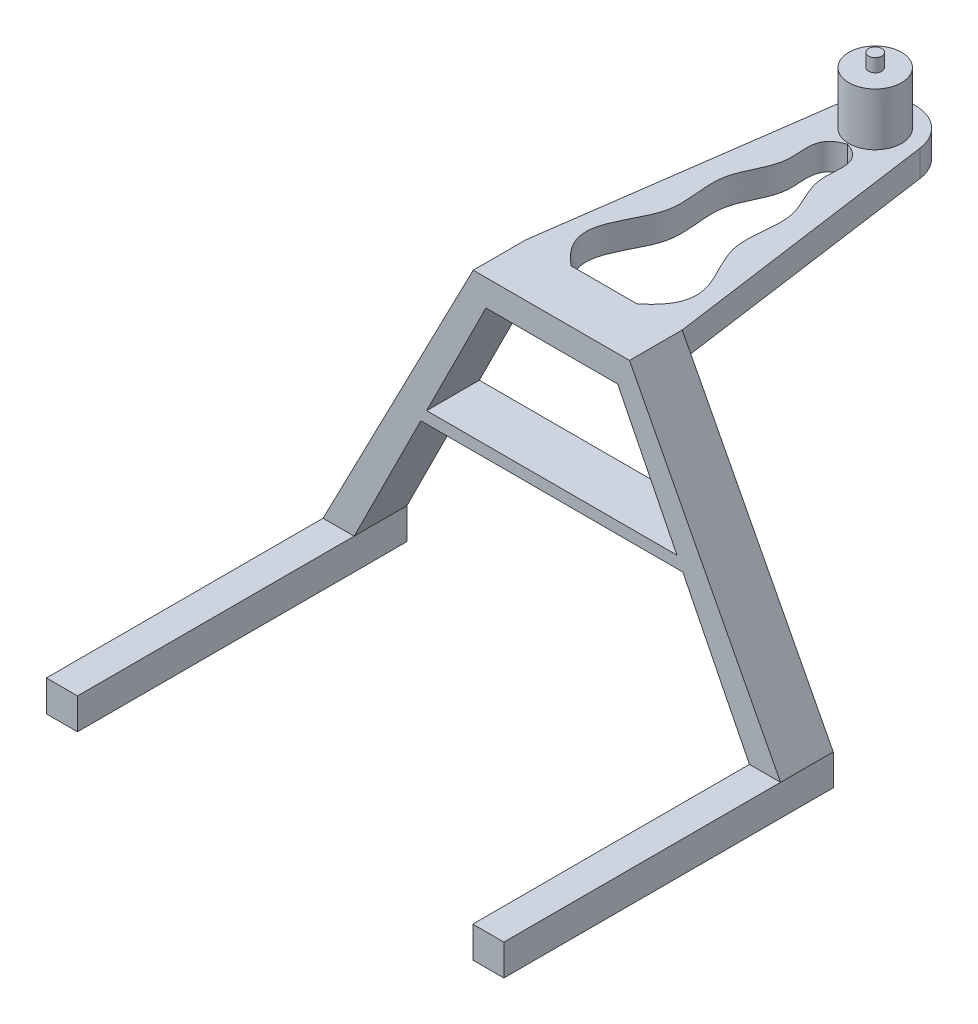
ISO-10303-21;
HEADER;
FILE_DESCRIPTION(('STEP AP214'),'2;1');
FILE_NAME('part.step','',(''),(''),'','','');
FILE_SCHEMA(('AUTOMOTIVE_DESIGN { 1 0 10303 214 1 1 1 1 }'));
ENDSEC;
DATA;
#1=APPLICATION_CONTEXT('core data for automotive mechanical design processes');
#2=APPLICATION_PROTOCOL_DEFINITION('international standard','automotive_design',2000,#1);
#3=PRODUCT_CONTEXT('',#1,'mechanical');
#4=PRODUCT('Part','Part','',(#3));
#5=PRODUCT_RELATED_PRODUCT_CATEGORY('part','',(#4));
#6=PRODUCT_DEFINITION_FORMATION('','',#4);
#7=PRODUCT_DEFINITION_CONTEXT('part definition',#1,'design');
#8=PRODUCT_DEFINITION('design','',#6,#7);
#9=PRODUCT_DEFINITION_SHAPE('','',#8);
#10=(LENGTH_UNIT() NAMED_UNIT(*) SI_UNIT(.MILLI.,.METRE.));
#11=(NAMED_UNIT(*) PLANE_ANGLE_UNIT() SI_UNIT($,.RADIAN.));
#12=(NAMED_UNIT(*) SI_UNIT($,.STERADIAN.) SOLID_ANGLE_UNIT());
#13=UNCERTAINTY_MEASURE_WITH_UNIT(LENGTH_MEASURE(1.E-05),#10,'distance_accuracy_value','');
#14=(GEOMETRIC_REPRESENTATION_CONTEXT(3) GLOBAL_UNCERTAINTY_ASSIGNED_CONTEXT((#13)) GLOBAL_UNIT_ASSIGNED_CONTEXT((#10,
#11,#12)) REPRESENTATION_CONTEXT('',''));
#15=CARTESIAN_POINT('',(0.,0.,0.));
#16=DIRECTION('',(0.,0.,1.));
#17=DIRECTION('',(1.,0.,0.));
#18=AXIS2_PLACEMENT_3D('',#15,#16,#17);
#19=CARTESIAN_POINT('',(0.,0.,0.));
#20=DIRECTION('',(0.,0.,1.));
#21=DIRECTION('',(1.,0.,0.));
#22=AXIS2_PLACEMENT_3D('',#19,#20,#21);
#23=PLANE('',#22);
#24=DIRECTION('',(0.447213595499958,-0.894427190999916,0.));
#25=VECTOR('',#24,1.);
#26=CARTESIAN_POINT('',(508.,567.9694,0.));
#27=LINE('',#26,#25);
#28=CARTESIAN_POINT('',(633.562258810129,316.844882379742,0.));
#29=VERTEX_POINT('',#28);
#30=CARTESIAN_POINT('',(762.,59.9694000000002,0.));
#31=VERTEX_POINT('',#30);
#32=EDGE_CURVE('E395',#29,#31,#27,.T.);
#33=ORIENTED_EDGE('',*,*,#32,.F.);
#34=DIRECTION('',(1.,0.,0.));
#35=VECTOR('',#34,1.);
#36=CARTESIAN_POINT('',(688.093813572336,316.844882379742,0.));
#37=LINE('',#36,#35);
#38=CARTESIAN_POINT('',(128.437741189871,316.844882379742,0.));
#39=VERTEX_POINT('',#38);
#40=EDGE_CURVE('E284',#39,#29,#37,.T.);
#41=ORIENTED_EDGE('',*,*,#40,.F.);
#42=DIRECTION('',(0.447213595499958,0.894427190999916,0.));
#43=VECTOR('',#42,1.);
#44=CARTESIAN_POINT('',(0.,59.9694,0.));
#45=LINE('',#44,#43);
#46=CARTESIAN_POINT('',(0.,59.9694,0.));
#47=VERTEX_POINT('',#46);
#48=EDGE_CURVE('E392',#47,#39,#45,.T.);
#49=ORIENTED_EDGE('',*,*,#48,.F.);
#50=DIRECTION('',(0.,1.,0.));
#51=VECTOR('',#50,1.);
#52=CARTESIAN_POINT('',(0.,0.,0.));
#53=LINE('',#52,#51);
#54=CARTESIAN_POINT('',(0.,0.,0.));
#55=VERTEX_POINT('',#54);
#56=EDGE_CURVE('E437',#55,#47,#53,.T.);
#57=ORIENTED_EDGE('',*,*,#56,.F.);
#58=DIRECTION('',(1.,0.,0.));
#59=VECTOR('',#58,1.);
#60=CARTESIAN_POINT('',(0.,0.,0.));
#61=LINE('',#60,#59);
#62=CARTESIAN_POINT('',(-59.9694,0.,0.));
#63=VERTEX_POINT('',#62);
#64=EDGE_CURVE('E443',#63,#55,#61,.T.);
#65=ORIENTED_EDGE('',*,*,#64,.F.);
#66=DIRECTION('',(0.,-1.,0.));
#67=VECTOR('',#66,1.);
#68=CARTESIAN_POINT('',(-59.9694,0.,0.));
#69=LINE('',#68,#67);
#70=CARTESIAN_POINT('',(-59.9694,59.9694,0.));
#71=VERTEX_POINT('',#70);
#72=EDGE_CURVE('E455',#71,#63,#69,.T.);
#73=ORIENTED_EDGE('',*,*,#72,.F.);
#74=DIRECTION('',(-0.45998927295107,-0.88792447244681,0.));
#75=VECTOR('',#74,1.);
#76=CARTESIAN_POINT('',(-59.9694,59.9694,0.));
#77=LINE('',#76,#75);
#78=CARTESIAN_POINT('',(229.51694,618.7694,0.));
#79=VERTEX_POINT('',#78);
#80=EDGE_CURVE('E403',#79,#71,#77,.T.);
#81=ORIENTED_EDGE('',*,*,#80,.F.);
#82=DIRECTION('',(0.,1.,0.));
#83=VECTOR('',#82,1.);
#84=CARTESIAN_POINT('',(229.51694,567.9694,0.));
#85=LINE('',#84,#83);
#86=CARTESIAN_POINT('',(229.51694,567.9694,0.));
#87=VERTEX_POINT('',#86);
#88=EDGE_CURVE('E281',#87,#79,#85,.T.);
#89=ORIENTED_EDGE('',*,*,#88,.F.);
#90=DIRECTION('',(1.,0.,0.));
#91=VECTOR('',#90,1.);
#92=CARTESIAN_POINT('',(229.51694,567.9694,0.));
#93=LINE('',#92,#91);
#94=CARTESIAN_POINT('',(254.,567.9694,0.));
#95=VERTEX_POINT('',#94);
#96=EDGE_CURVE('E250',#87,#95,#93,.T.);
#97=ORIENTED_EDGE('',*,*,#96,.T.);
#98=CARTESIAN_POINT('',(139.7,339.3694,0.));
#99=VERTEX_POINT('',#98);
#100=EDGE_CURVE('E360',#99,#95,#45,.T.);
#101=ORIENTED_EDGE('',*,*,#100,.F.);
#102=DIRECTION('',(-1.,0.,0.));
#103=VECTOR('',#102,1.);
#104=CARTESIAN_POINT('',(84.7737699999999,339.3694,0.));
#105=LINE('',#104,#103);
#106=CARTESIAN_POINT('',(622.3,339.3694,0.));
#107=VERTEX_POINT('',#106);
#108=EDGE_CURVE('E299',#107,#99,#105,.T.);
#109=ORIENTED_EDGE('',*,*,#108,.F.);
#110=CARTESIAN_POINT('',(508.,567.9694,0.));
#111=VERTEX_POINT('',#110);
#112=EDGE_CURVE('E396',#111,#107,#27,.T.);
#113=ORIENTED_EDGE('',*,*,#112,.F.);
#114=CARTESIAN_POINT('',(530.740058052968,567.9694,0.));
#115=VERTEX_POINT('',#114);
#116=EDGE_CURVE('E258',#111,#115,#93,.T.);
#117=ORIENTED_EDGE('',*,*,#116,.T.);
#118=DIRECTION('',(0.,1.,0.));
#119=VECTOR('',#118,1.);
#120=CARTESIAN_POINT('',(530.740058052968,567.9694,0.));
#121=LINE('',#120,#119);
#122=CARTESIAN_POINT('',(530.740058052968,618.7694,0.));
#123=VERTEX_POINT('',#122);
#124=EDGE_CURVE('E270',#115,#123,#121,.T.);
#125=ORIENTED_EDGE('',*,*,#124,.T.);
#126=DIRECTION('',(-0.462168682907567,0.88679203229364,0.));
#127=VECTOR('',#126,1.);
#128=CARTESIAN_POINT('',(821.9694,59.9694000000002,0.));
#129=LINE('',#128,#127);
#130=CARTESIAN_POINT('',(821.9694,59.9694000000002,0.));
#131=VERTEX_POINT('',#130);
#132=EDGE_CURVE('E399',#131,#123,#129,.T.);
#133=ORIENTED_EDGE('',*,*,#132,.F.);
#134=DIRECTION('',(0.,1.,0.));
#135=VECTOR('',#134,1.);
#136=CARTESIAN_POINT('',(821.9694,1.94694268781174E-13,0.));
#137=LINE('',#136,#135);
#138=CARTESIAN_POINT('',(821.9694,1.94694268781174E-13,0.));
#139=VERTEX_POINT('',#138);
#140=EDGE_CURVE('E323',#139,#131,#137,.T.);
#141=ORIENTED_EDGE('',*,*,#140,.F.);
#142=DIRECTION('',(1.,0.,0.));
#143=VECTOR('',#142,1.);
#144=CARTESIAN_POINT('',(821.9694,1.94694268781174E-13,0.));
#145=LINE('',#144,#143);
#146=CARTESIAN_POINT('',(762.,1.87350135405495E-13,0.));
#147=VERTEX_POINT('',#146);
#148=EDGE_CURVE('E329',#147,#139,#145,.T.);
#149=ORIENTED_EDGE('',*,*,#148,.F.);
#150=DIRECTION('',(0.,-1.,0.));
#151=VECTOR('',#150,1.);
#152=CARTESIAN_POINT('',(762.,1.87350135405495E-13,0.));
#153=LINE('',#152,#151);
#154=EDGE_CURVE('E341',#31,#147,#153,.T.);
#155=ORIENTED_EDGE('',*,*,#154,.F.);
#156=EDGE_LOOP('',(#33,#41,#49,#57,#65,#73,#81,#89,#97,#101,#109,#113,#117,#125,#133,#141,#149,#155));
#157=FACE_BOUND('',#156,.T.);
#158=ADVANCED_FACE('F38',(#157),#23,.F.);
#159=CARTESIAN_POINT('',(0.,59.9694,101.6));
#160=DIRECTION('',(-0.894427190999916,0.447213595499958,0.));
#161=DIRECTION('',(-0.447213595499958,-0.894427190999916,0.));
#162=AXIS2_PLACEMENT_3D('',#159,#160,#161);
#163=PLANE('',#162);
#164=DIRECTION('',(0.,0.,-1.));
#165=VECTOR('',#164,1.);
#166=CARTESIAN_POINT('',(128.437741189871,316.844882379742,101.6));
#167=LINE('',#166,#165);
#168=CARTESIAN_POINT('',(128.437741189871,316.844882379742,101.6));
#169=VERTEX_POINT('',#168);
#170=EDGE_CURVE('E319',#169,#39,#167,.T.);
#171=ORIENTED_EDGE('',*,*,#170,.F.);
#172=DIRECTION('',(0.447213595499958,0.894427190999916,0.));
#173=VECTOR('',#172,1.);
#174=CARTESIAN_POINT('',(0.,59.9694,101.6));
#175=LINE('',#174,#173);
#176=CARTESIAN_POINT('',(0.,59.9694,101.6));
#177=VERTEX_POINT('',#176);
#178=EDGE_CURVE('E361',#177,#169,#175,.T.);
#179=ORIENTED_EDGE('',*,*,#178,.F.);
#180=DIRECTION('',(0.,0.,-1.));
#181=VECTOR('',#180,1.);
#182=CARTESIAN_POINT('',(0.,59.9694,101.6));
#183=LINE('',#182,#181);
#184=EDGE_CURVE('E391',#177,#47,#183,.T.);
#185=ORIENTED_EDGE('',*,*,#184,.T.);
#186=ORIENTED_EDGE('',*,*,#48,.T.);
#187=EDGE_LOOP('',(#171,#179,#185,#186));
#188=FACE_BOUND('',#187,.T.);
#189=ADVANCED_FACE('F501',(#188),#163,.F.);
#190=DIRECTION('',(0.,0.,1.));
#191=VECTOR('',#190,1.);
#192=CARTESIAN_POINT('',(139.7,339.3694,101.6));
#193=LINE('',#192,#191);
#194=CARTESIAN_POINT('',(139.7,339.3694,101.6));
#195=VERTEX_POINT('',#194);
#196=EDGE_CURVE('E311',#99,#195,#193,.T.);
#197=ORIENTED_EDGE('',*,*,#196,.F.);
#198=ORIENTED_EDGE('',*,*,#100,.T.);
#199=DIRECTION('',(0.,0.,-1.));
#200=VECTOR('',#199,1.);
#201=CARTESIAN_POINT('',(254.,567.9694,101.6));
#202=LINE('',#201,#200);
#203=CARTESIAN_POINT('',(254.,567.9694,101.6));
#204=VERTEX_POINT('',#203);
#205=EDGE_CURVE('E433',#204,#95,#202,.T.);
#206=ORIENTED_EDGE('',*,*,#205,.F.);
#207=EDGE_CURVE('E366',#195,#204,#175,.T.);
#208=ORIENTED_EDGE('',*,*,#207,.F.);
#209=EDGE_LOOP('',(#197,#198,#206,#208));
#210=FACE_BOUND('',#209,.T.);
#211=ADVANCED_FACE('F506',(#210),#163,.F.);
#212=CARTESIAN_POINT('',(508.,567.9694,101.6));
#213=DIRECTION('',(0.894427190999916,0.447213595499958,0.));
#214=DIRECTION('',(-0.447213595499958,0.894427190999916,0.));
#215=AXIS2_PLACEMENT_3D('',#212,#213,#214);
#216=PLANE('',#215);
#217=DIRECTION('',(0.,0.,1.));
#218=VECTOR('',#217,1.);
#219=CARTESIAN_POINT('',(633.562258810129,316.844882379742,101.6));
#220=LINE('',#219,#218);
#221=CARTESIAN_POINT('',(633.562258810129,316.844882379742,101.6));
#222=VERTEX_POINT('',#221);
#223=EDGE_CURVE('E315',#29,#222,#220,.T.);
#224=ORIENTED_EDGE('',*,*,#223,.F.);
#225=ORIENTED_EDGE('',*,*,#32,.T.);
#226=DIRECTION('',(0.,0.,-1.));
#227=VECTOR('',#226,1.);
#228=CARTESIAN_POINT('',(762.,59.9694000000002,101.6));
#229=LINE('',#228,#227);
#230=CARTESIAN_POINT('',(762.,59.9694000000002,101.6));
#231=VERTEX_POINT('',#230);
#232=EDGE_CURVE('E425',#231,#31,#229,.T.);
#233=ORIENTED_EDGE('',*,*,#232,.F.);
#234=DIRECTION('',(0.447213595499958,-0.894427190999916,0.));
#235=VECTOR('',#234,1.);
#236=CARTESIAN_POINT('',(508.,567.9694,101.6));
#237=LINE('',#236,#235);
#238=EDGE_CURVE('E369',#222,#231,#237,.T.);
#239=ORIENTED_EDGE('',*,*,#238,.F.);
#240=EDGE_LOOP('',(#224,#225,#233,#239));
#241=FACE_BOUND('',#240,.T.);
#242=ADVANCED_FACE('F528',(#241),#216,.F.);
#243=DIRECTION('',(0.,0.,-1.));
#244=VECTOR('',#243,1.);
#245=CARTESIAN_POINT('',(622.3,339.3694,101.6));
#246=LINE('',#245,#244);
#247=CARTESIAN_POINT('',(622.3,339.3694,101.6));
#248=VERTEX_POINT('',#247);
#249=EDGE_CURVE('E303',#248,#107,#246,.T.);
#250=ORIENTED_EDGE('',*,*,#249,.F.);
#251=CARTESIAN_POINT('',(508.,567.9694,101.6));
#252=VERTEX_POINT('',#251);
#253=EDGE_CURVE('E370',#252,#248,#237,.T.);
#254=ORIENTED_EDGE('',*,*,#253,.F.);
#255=DIRECTION('',(0.,0.,-1.));
#256=VECTOR('',#255,1.);
#257=CARTESIAN_POINT('',(508.,567.9694,101.6));
#258=LINE('',#257,#256);
#259=EDGE_CURVE('E429',#252,#111,#258,.T.);
#260=ORIENTED_EDGE('',*,*,#259,.T.);
#261=ORIENTED_EDGE('',*,*,#112,.T.);
#262=EDGE_LOOP('',(#250,#254,#260,#261));
#263=FACE_BOUND('',#262,.T.);
#264=ADVANCED_FACE('F522',(#263),#216,.F.);
#265=CARTESIAN_POINT('',(0.,59.9694,635.));
#266=DIRECTION('',(0.,-1.,0.));
#267=DIRECTION('',(0.,0.,-1.));
#268=AXIS2_PLACEMENT_3D('',#265,#266,#267);
#269=PLANE('',#268);
#270=DIRECTION('',(1.,0.,0.));
#271=VECTOR('',#270,1.);
#272=CARTESIAN_POINT('',(0.,59.9694,101.6));
#273=LINE('',#272,#271);
#274=CARTESIAN_POINT('',(-59.9694,59.9694,101.6));
#275=VERTEX_POINT('',#274);
#276=EDGE_CURVE('E387',#275,#177,#273,.T.);
#277=ORIENTED_EDGE('',*,*,#276,.F.);
#278=DIRECTION('',(0.,0.,-1.));
#279=VECTOR('',#278,1.);
#280=CARTESIAN_POINT('',(-59.9694,59.9694,635.));
#281=LINE('',#280,#279);
#282=CARTESIAN_POINT('',(-59.9694,59.9694,635.));
#283=VERTEX_POINT('',#282);
#284=EDGE_CURVE('E467',#283,#275,#281,.T.);
#285=ORIENTED_EDGE('',*,*,#284,.F.);
#286=DIRECTION('',(-1.,0.,0.));
#287=VECTOR('',#286,1.);
#288=CARTESIAN_POINT('',(0.,59.9694,635.));
#289=LINE('',#288,#287);
#290=CARTESIAN_POINT('',(0.,59.9694,635.));
#291=VERTEX_POINT('',#290);
#292=EDGE_CURVE('E442',#291,#283,#289,.T.);
#293=ORIENTED_EDGE('',*,*,#292,.F.);
#294=DIRECTION('',(0.,0.,-1.));
#295=VECTOR('',#294,1.);
#296=CARTESIAN_POINT('',(0.,59.9694,635.));
#297=LINE('',#296,#295);
#298=EDGE_CURVE('E470',#291,#177,#297,.T.);
#299=ORIENTED_EDGE('',*,*,#298,.T.);
#300=EDGE_LOOP('',(#277,#285,#293,#299));
#301=FACE_BOUND('',#300,.T.);
#302=ADVANCED_FACE('F520',(#301),#269,.F.);
#303=CARTESIAN_POINT('',(0.,0.,635.));
#304=DIRECTION('',(-1.,0.,0.));
#305=DIRECTION('',(0.,0.,1.));
#306=AXIS2_PLACEMENT_3D('',#303,#304,#305);
#307=PLANE('',#306);
#308=ORIENTED_EDGE('',*,*,#56,.T.);
#309=ORIENTED_EDGE('',*,*,#184,.F.);
#310=ORIENTED_EDGE('',*,*,#298,.F.);
#311=DIRECTION('',(0.,1.,0.));
#312=VECTOR('',#311,1.);
#313=CARTESIAN_POINT('',(0.,0.,635.));
#314=LINE('',#313,#312);
#315=CARTESIAN_POINT('',(0.,0.,635.));
#316=VERTEX_POINT('',#315);
#317=EDGE_CURVE('E438',#316,#291,#314,.T.);
#318=ORIENTED_EDGE('',*,*,#317,.F.);
#319=DIRECTION('',(0.,0.,-1.));
#320=VECTOR('',#319,1.);
#321=CARTESIAN_POINT('',(0.,0.,635.));
#322=LINE('',#321,#320);
#323=EDGE_CURVE('E452',#316,#55,#322,.T.);
#324=ORIENTED_EDGE('',*,*,#323,.T.);
#325=EDGE_LOOP('',(#308,#309,#310,#318,#324));
#326=FACE_BOUND('',#325,.T.);
#327=ADVANCED_FACE('F40',(#326),#307,.F.);
#328=CARTESIAN_POINT('',(-59.9694,0.,635.));
#329=DIRECTION('',(1.,0.,0.));
#330=DIRECTION('',(0.,1.,0.));
#331=AXIS2_PLACEMENT_3D('',#328,#329,#330);
#332=PLANE('',#331);
#333=ORIENTED_EDGE('',*,*,#72,.T.);
#334=DIRECTION('',(0.,0.,-1.));
#335=VECTOR('',#334,1.);
#336=CARTESIAN_POINT('',(-59.9694,0.,635.));
#337=LINE('',#336,#335);
#338=CARTESIAN_POINT('',(-59.9694,0.,635.));
#339=VERTEX_POINT('',#338);
#340=EDGE_CURVE('E463',#339,#63,#337,.T.);
#341=ORIENTED_EDGE('',*,*,#340,.F.);
#342=DIRECTION('',(0.,-1.,0.));
#343=VECTOR('',#342,1.);
#344=CARTESIAN_POINT('',(-59.9694,0.,635.));
#345=LINE('',#344,#343);
#346=EDGE_CURVE('E446',#283,#339,#345,.T.);
#347=ORIENTED_EDGE('',*,*,#346,.F.);
#348=ORIENTED_EDGE('',*,*,#284,.T.);
#349=DIRECTION('',(0.,0.,-1.));
#350=VECTOR('',#349,1.);
#351=CARTESIAN_POINT('',(-59.9694,59.9694,101.6));
#352=LINE('',#351,#350);
#353=EDGE_CURVE('E409',#275,#71,#352,.T.);
#354=ORIENTED_EDGE('',*,*,#353,.T.);
#355=EDGE_LOOP('',(#333,#341,#347,#348,#354));
#356=FACE_BOUND('',#355,.T.);
#357=ADVANCED_FACE('F516',(#356),#332,.F.);
#358=CARTESIAN_POINT('',(0.,0.,635.));
#359=DIRECTION('',(0.,1.,0.));
#360=DIRECTION('',(-1.,0.,0.));
#361=AXIS2_PLACEMENT_3D('',#358,#359,#360);
#362=PLANE('',#361);
#363=ORIENTED_EDGE('',*,*,#64,.T.);
#364=ORIENTED_EDGE('',*,*,#323,.F.);
#365=DIRECTION('',(1.,0.,0.));
#366=VECTOR('',#365,1.);
#367=CARTESIAN_POINT('',(0.,0.,635.));
#368=LINE('',#367,#366);
#369=EDGE_CURVE('E449',#339,#316,#368,.T.);
#370=ORIENTED_EDGE('',*,*,#369,.F.);
#371=ORIENTED_EDGE('',*,*,#340,.T.);
#372=EDGE_LOOP('',(#363,#364,#370,#371));
#373=FACE_BOUND('',#372,.T.);
#374=ADVANCED_FACE('F513',(#373),#362,.F.);
#375=CARTESIAN_POINT('',(0.,0.,635.));
#376=DIRECTION('',(0.,0.,1.));
#377=DIRECTION('',(1.,0.,0.));
#378=AXIS2_PLACEMENT_3D('',#375,#376,#377);
#379=PLANE('',#378);
#380=ORIENTED_EDGE('',*,*,#317,.T.);
#381=ORIENTED_EDGE('',*,*,#292,.T.);
#382=ORIENTED_EDGE('',*,*,#346,.T.);
#383=ORIENTED_EDGE('',*,*,#369,.T.);
#384=EDGE_LOOP('',(#380,#381,#382,#383));
#385=FACE_BOUND('',#384,.T.);
#386=ADVANCED_FACE('F512',(#385),#379,.T.);
#387=CARTESIAN_POINT('',(254.,567.9694,101.6));
#388=DIRECTION('',(0.,1.,0.));
#389=DIRECTION('',(0.,0.,1.));
#390=AXIS2_PLACEMENT_3D('',#387,#388,#389);
#391=PLANE('',#390);
#392=CARTESIAN_POINT('',(443.63894,567.9694,0.));
#393=CARTESIAN_POINT('',(534.092966377413,567.9694,-73.2725503091512));
#394=CARTESIAN_POINT('',(412.875522590463,567.9694,-153.81005242292));
#395=CARTESIAN_POINT('',(462.148891496792,567.9694,-296.076248680117));
#396=CARTESIAN_POINT('',(393.499435083084,567.9694,-382.146243658327));
#397=CARTESIAN_POINT('',(427.489547728666,567.9694,-454.141623855723));
#398=CARTESIAN_POINT('',(380.13894,567.9694,-469.395677589399));
#399=B_SPLINE_CURVE_WITH_KNOTS('',3,(#392,#393,#394,#395,#396,#397,#398),.UNSPECIFIED.,.F.,.F.,
(4,1,1,1,4),(0.,0.403522035046073,0.617987335771893,0.803164244073778,1.),.UNSPECIFIED.);
#400=CARTESIAN_POINT('',(443.63894,567.9694,0.));
#401=VERTEX_POINT('',#400);
#402=CARTESIAN_POINT('',(380.13894,567.9694,-469.395677589399));
#403=VERTEX_POINT('',#402);
#404=EDGE_CURVE('E206',#401,#403,#399,.T.);
#405=ORIENTED_EDGE('',*,*,#404,.T.);
#406=CARTESIAN_POINT('',(380.13894,567.9694,-469.395677589399));
#407=CARTESIAN_POINT('',(332.788332271334,567.9694,-454.141623855723));
#408=CARTESIAN_POINT('',(366.778444916916,567.9694,-382.146243658327));
#409=CARTESIAN_POINT('',(298.128988503207,567.9694,-296.076248680117));
#410=CARTESIAN_POINT('',(347.402357409537,567.9694,-153.81005242292));
#411=CARTESIAN_POINT('',(226.184913622587,567.9694,-73.2725503091512));
#412=CARTESIAN_POINT('',(316.63894,567.9694,0.));
#413=B_SPLINE_CURVE_WITH_KNOTS('',3,(#406,#407,#408,#409,#410,#411,#412),.UNSPECIFIED.,.F.,.F.,
(4,1,1,1,4),(0.,0.196835755926222,0.382012664228107,0.596477964953927,1.),.UNSPECIFIED.);
#414=CARTESIAN_POINT('',(316.63894,567.9694,0.));
#415=VERTEX_POINT('',#414);
#416=EDGE_CURVE('E240',#403,#415,#413,.T.);
#417=ORIENTED_EDGE('',*,*,#416,.T.);
#418=DIRECTION('',(1.,0.,0.));
#419=VECTOR('',#418,1.);
#420=CARTESIAN_POINT('',(254.,567.9694,0.));
#421=LINE('',#420,#419);
#422=EDGE_CURVE('E232',#415,#401,#421,.T.);
#423=ORIENTED_EDGE('',*,*,#422,.T.);
#424=EDGE_LOOP('',(#405,#417,#423));
#425=FACE_BOUND('',#424,.T.);
#426=ORIENTED_EDGE('',*,*,#205,.T.);
#427=ORIENTED_EDGE('',*,*,#96,.F.);
#428=DIRECTION('',(-0.138185273415234,0.,0.990406396491439));
#429=VECTOR('',#428,1.);
#430=CARTESIAN_POINT('',(229.51694,567.9694,0.));
#431=LINE('',#430,#429);
#432=CARTESIAN_POINT('',(303.928499026484,567.9694,-533.325167084014));
#433=VERTEX_POINT('',#432);
#434=EDGE_CURVE('E266',#433,#87,#431,.T.);
#435=ORIENTED_EDGE('',*,*,#434,.F.);
#436=CARTESIAN_POINT('',(380.128499026484,567.9694,-522.6934527983));
#437=DIRECTION('',(0.,1.,0.));
#438=DIRECTION('',(0.,0.,-1.));
#439=AXIS2_PLACEMENT_3D('',#436,#437,#438);
#440=CIRCLE('',#439,76.9381137580917);
#441=CARTESIAN_POINT('',(456.328499026484,567.9694,-533.325167084014));
#442=VERTEX_POINT('',#441);
#443=EDGE_CURVE('E262',#442,#433,#440,.T.);
#444=ORIENTED_EDGE('',*,*,#443,.F.);
#445=DIRECTION('',(-0.138185273415234,0.,-0.990406396491439));
#446=VECTOR('',#445,1.);
#447=CARTESIAN_POINT('',(530.740058052968,567.9694,0.));
#448=LINE('',#447,#446);
#449=EDGE_CURVE('E256',#115,#442,#448,.T.);
#450=ORIENTED_EDGE('',*,*,#449,.F.);
#451=ORIENTED_EDGE('',*,*,#116,.F.);
#452=ORIENTED_EDGE('',*,*,#259,.F.);
#453=DIRECTION('',(1.,0.,0.));
#454=VECTOR('',#453,1.);
#455=CARTESIAN_POINT('',(254.,567.9694,101.6));
#456=LINE('',#455,#454);
#457=EDGE_CURVE('E365',#204,#252,#456,.T.);
#458=ORIENTED_EDGE('',*,*,#457,.F.);
#459=EDGE_LOOP('',(#426,#427,#435,#444,#450,#451,#452,#458));
#460=FACE_BOUND('',#459,.T.);
#461=ADVANCED_FACE('F497',(#425,#460),#391,.F.);
#462=CARTESIAN_POINT('',(821.9694,59.9694000000002,101.6));
#463=DIRECTION('',(-0.88679203229364,-0.462168682907567,0.));
#464=DIRECTION('',(0.462168682907567,-0.88679203229364,0.));
#465=AXIS2_PLACEMENT_3D('',#462,#463,#464);
#466=PLANE('',#465);
#467=DIRECTION('',(0.,0.,-1.));
#468=VECTOR('',#467,1.);
#469=CARTESIAN_POINT('',(530.740058052968,618.7694,101.6));
#470=LINE('',#469,#468);
#471=CARTESIAN_POINT('',(530.740058052968,618.7694,101.6));
#472=VERTEX_POINT('',#471);
#473=EDGE_CURVE('E417',#472,#123,#470,.T.);
#474=ORIENTED_EDGE('',*,*,#473,.F.);
#475=DIRECTION('',(-0.462168682907567,0.88679203229364,0.));
#476=VECTOR('',#475,1.);
#477=CARTESIAN_POINT('',(821.9694,59.9694000000002,101.6));
#478=LINE('',#477,#476);
#479=CARTESIAN_POINT('',(821.9694,59.9694000000002,101.6));
#480=VERTEX_POINT('',#479);
#481=EDGE_CURVE('E378',#480,#472,#478,.T.);
#482=ORIENTED_EDGE('',*,*,#481,.F.);
#483=DIRECTION('',(0.,0.,-1.));
#484=VECTOR('',#483,1.);
#485=CARTESIAN_POINT('',(821.9694,59.9694000000002,101.6));
#486=LINE('',#485,#484);
#487=EDGE_CURVE('E421',#480,#131,#486,.T.);
#488=ORIENTED_EDGE('',*,*,#487,.T.);
#489=ORIENTED_EDGE('',*,*,#132,.T.);
#490=EDGE_LOOP('',(#474,#482,#488,#489));
#491=FACE_BOUND('',#490,.T.);
#492=ADVANCED_FACE('F488',(#491),#466,.F.);
#493=CARTESIAN_POINT('',(229.51694,618.7694,101.6));
#494=DIRECTION('',(0.,-1.,0.));
#495=DIRECTION('',(0.,0.,-1.));
#496=AXIS2_PLACEMENT_3D('',#493,#494,#495);
#497=PLANE('',#496);
#498=CARTESIAN_POINT('',(380.128499026484,618.7694,-522.6934527983));
#499=DIRECTION('',(0.,-1.,0.));
#500=DIRECTION('',(0.,0.,-1.));
#501=AXIS2_PLACEMENT_3D('',#498,#499,#500);
#502=CIRCLE('',#501,50.8);
#503=CARTESIAN_POINT('',(380.128499026484,618.7694,-573.4934527983));
#504=VERTEX_POINT('',#503);
#505=EDGE_CURVE('E42',#504,#504,#502,.F.);
#506=ORIENTED_EDGE('',*,*,#505,.F.);
#507=EDGE_LOOP('',(#506));
#508=FACE_BOUND('',#507,.T.);
#509=DIRECTION('',(1.,0.,0.));
#510=VECTOR('',#509,1.);
#511=CARTESIAN_POINT('',(316.63894,618.7694,0.));
#512=LINE('',#511,#510);
#513=CARTESIAN_POINT('',(316.63894,618.7694,0.));
#514=VERTEX_POINT('',#513);
#515=CARTESIAN_POINT('',(443.63894,618.7694,0.));
#516=VERTEX_POINT('',#515);
#517=EDGE_CURVE('E213',#514,#516,#512,.T.);
#518=ORIENTED_EDGE('',*,*,#517,.F.);
#519=CARTESIAN_POINT('',(380.13894,618.7694,-469.395677589399));
#520=CARTESIAN_POINT('',(332.788332271334,618.7694,-454.141623855723));
#521=CARTESIAN_POINT('',(366.778444916916,618.7694,-382.146243658327));
#522=CARTESIAN_POINT('',(298.128988503207,618.7694,-296.076248680117));
#523=CARTESIAN_POINT('',(347.402357409537,618.7694,-153.81005242292));
#524=CARTESIAN_POINT('',(226.184913622587,618.7694,-73.2725503091512));
#525=CARTESIAN_POINT('',(316.63894,618.7694,0.));
#526=B_SPLINE_CURVE_WITH_KNOTS('',3,(#519,#520,#521,#522,#523,#524,#525),.UNSPECIFIED.,.F.,.F.,
(4,1,1,1,4),(0.,0.196835755926222,0.382012664228107,0.596477964953927,1.),.UNSPECIFIED.);
#527=CARTESIAN_POINT('',(380.13894,618.7694,-469.395677589399));
#528=VERTEX_POINT('',#527);
#529=EDGE_CURVE('E63',#528,#514,#526,.T.);
#530=ORIENTED_EDGE('',*,*,#529,.F.);
#531=CARTESIAN_POINT('',(443.63894,618.7694,0.));
#532=CARTESIAN_POINT('',(534.092966377413,618.7694,-73.2725503091512));
#533=CARTESIAN_POINT('',(412.875522590463,618.7694,-153.81005242292));
#534=CARTESIAN_POINT('',(462.148891496792,618.7694,-296.076248680117));
#535=CARTESIAN_POINT('',(393.499435083084,618.7694,-382.146243658327));
#536=CARTESIAN_POINT('',(427.489547728666,618.7694,-454.141623855723));
#537=CARTESIAN_POINT('',(380.13894,618.7694,-469.395677589399));
#538=B_SPLINE_CURVE_WITH_KNOTS('',3,(#531,#532,#533,#534,#535,#536,#537),.UNSPECIFIED.,.F.,.F.,
(4,1,1,1,4),(0.,0.403522035046073,0.617987335771893,0.803164244073778,1.),.UNSPECIFIED.);
#539=EDGE_CURVE('E204',#516,#528,#538,.T.);
#540=ORIENTED_EDGE('',*,*,#539,.F.);
#541=EDGE_LOOP('',(#518,#530,#540));
#542=FACE_BOUND('',#541,.T.);
#543=ORIENTED_EDGE('',*,*,#473,.T.);
#544=DIRECTION('',(-0.138185273415234,0.,-0.990406396491439));
#545=VECTOR('',#544,1.);
#546=CARTESIAN_POINT('',(530.740058052968,618.7694,0.));
#547=LINE('',#546,#545);
#548=CARTESIAN_POINT('',(456.328499026484,618.7694,-533.325167084014));
#549=VERTEX_POINT('',#548);
#550=EDGE_CURVE('E249',#123,#549,#547,.T.);
#551=ORIENTED_EDGE('',*,*,#550,.T.);
#552=CARTESIAN_POINT('',(380.128499026484,618.7694,-522.6934527983));
#553=DIRECTION('',(0.,1.,0.));
#554=DIRECTION('',(0.,0.,-1.));
#555=AXIS2_PLACEMENT_3D('',#552,#553,#554);
#556=CIRCLE('',#555,76.9381137580917);
#557=CARTESIAN_POINT('',(303.928499026484,618.7694,-533.325167084014));
#558=VERTEX_POINT('',#557);
#559=EDGE_CURVE('E274',#549,#558,#556,.T.);
#560=ORIENTED_EDGE('',*,*,#559,.T.);
#561=DIRECTION('',(-0.138185273415234,0.,0.990406396491439));
#562=VECTOR('',#561,1.);
#563=CARTESIAN_POINT('',(229.51694,618.7694,0.));
#564=LINE('',#563,#562);
#565=EDGE_CURVE('E257',#558,#79,#564,.T.);
#566=ORIENTED_EDGE('',*,*,#565,.T.);
#567=DIRECTION('',(0.,0.,-1.));
#568=VECTOR('',#567,1.);
#569=CARTESIAN_POINT('',(229.51694,618.7694,101.6));
#570=LINE('',#569,#568);
#571=CARTESIAN_POINT('',(229.51694,618.7694,101.6));
#572=VERTEX_POINT('',#571);
#573=EDGE_CURVE('E413',#572,#79,#570,.T.);
#574=ORIENTED_EDGE('',*,*,#573,.F.);
#575=DIRECTION('',(-1.,0.,0.));
#576=VECTOR('',#575,1.);
#577=CARTESIAN_POINT('',(229.51694,618.7694,101.6));
#578=LINE('',#577,#576);
#579=EDGE_CURVE('E381',#472,#572,#578,.T.);
#580=ORIENTED_EDGE('',*,*,#579,.F.);
#581=EDGE_LOOP('',(#543,#551,#560,#566,#574,#580));
#582=FACE_BOUND('',#581,.T.);
#583=ADVANCED_FACE('F218',(#508,#542,#582),#497,.F.);
#584=CARTESIAN_POINT('',(-59.9694,59.9694,101.6));
#585=DIRECTION('',(0.88792447244681,-0.45998927295107,0.));
#586=DIRECTION('',(0.45998927295107,0.88792447244681,0.));
#587=AXIS2_PLACEMENT_3D('',#584,#585,#586);
#588=PLANE('',#587);
#589=ORIENTED_EDGE('',*,*,#80,.T.);
#590=ORIENTED_EDGE('',*,*,#353,.F.);
#591=DIRECTION('',(-0.45998927295107,-0.88792447244681,0.));
#592=VECTOR('',#591,1.);
#593=CARTESIAN_POINT('',(-59.9694,59.9694,101.6));
#594=LINE('',#593,#592);
#595=EDGE_CURVE('E384',#572,#275,#594,.T.);
#596=ORIENTED_EDGE('',*,*,#595,.F.);
#597=ORIENTED_EDGE('',*,*,#573,.T.);
#598=EDGE_LOOP('',(#589,#590,#596,#597));
#599=FACE_BOUND('',#598,.T.);
#600=ADVANCED_FACE('F487',(#599),#588,.F.);
#601=CARTESIAN_POINT('',(0.,0.,101.6));
#602=DIRECTION('',(0.,0.,-1.));
#603=DIRECTION('',(-1.,0.,0.));
#604=AXIS2_PLACEMENT_3D('',#601,#602,#603);
#605=PLANE('',#604);
#606=DIRECTION('',(-1.,0.,0.));
#607=VECTOR('',#606,1.);
#608=CARTESIAN_POINT('',(84.7737699999999,339.3694,101.6));
#609=LINE('',#608,#607);
#610=EDGE_CURVE('E298',#248,#195,#609,.T.);
#611=ORIENTED_EDGE('',*,*,#610,.T.);
#612=ORIENTED_EDGE('',*,*,#207,.T.);
#613=ORIENTED_EDGE('',*,*,#457,.T.);
#614=ORIENTED_EDGE('',*,*,#253,.T.);
#615=EDGE_LOOP('',(#611,#612,#613,#614));
#616=FACE_BOUND('',#615,.T.);
#617=ORIENTED_EDGE('',*,*,#595,.T.);
#618=ORIENTED_EDGE('',*,*,#276,.T.);
#619=ORIENTED_EDGE('',*,*,#178,.T.);
#620=DIRECTION('',(1.,0.,0.));
#621=VECTOR('',#620,1.);
#622=CARTESIAN_POINT('',(688.093813572336,316.844882379742,101.6));
#623=LINE('',#622,#621);
#624=EDGE_CURVE('E294',#169,#222,#623,.T.);
#625=ORIENTED_EDGE('',*,*,#624,.T.);
#626=ORIENTED_EDGE('',*,*,#238,.T.);
#627=DIRECTION('',(1.,0.,0.));
#628=VECTOR('',#627,1.);
#629=CARTESIAN_POINT('',(762.,59.9694000000002,101.6));
#630=LINE('',#629,#628);
#631=EDGE_CURVE('E374',#231,#480,#630,.T.);
#632=ORIENTED_EDGE('',*,*,#631,.T.);
#633=ORIENTED_EDGE('',*,*,#481,.T.);
#634=ORIENTED_EDGE('',*,*,#579,.T.);
#635=EDGE_LOOP('',(#617,#618,#619,#625,#626,#632,#633,#634));
#636=FACE_BOUND('',#635,.T.);
#637=ADVANCED_FACE('F494',(#616,#636),#605,.F.);
#638=CARTESIAN_POINT('',(821.9694,59.9694000000002,635.));
#639=DIRECTION('',(0.,-1.,0.));
#640=DIRECTION('',(1.,0.,0.));
#641=AXIS2_PLACEMENT_3D('',#638,#639,#640);
#642=PLANE('',#641);
#643=DIRECTION('',(0.,0.,-1.));
#644=VECTOR('',#643,1.);
#645=CARTESIAN_POINT('',(821.9694,59.9694000000002,635.));
#646=LINE('',#645,#644);
#647=CARTESIAN_POINT('',(821.9694,59.9694000000002,635.));
#648=VERTEX_POINT('',#647);
#649=EDGE_CURVE('E357',#648,#480,#646,.T.);
#650=ORIENTED_EDGE('',*,*,#649,.T.);
#651=ORIENTED_EDGE('',*,*,#631,.F.);
#652=DIRECTION('',(0.,0.,-1.));
#653=VECTOR('',#652,1.);
#654=CARTESIAN_POINT('',(762.,59.9694000000002,635.));
#655=LINE('',#654,#653);
#656=CARTESIAN_POINT('',(762.,59.9694000000002,635.));
#657=VERTEX_POINT('',#656);
#658=EDGE_CURVE('E353',#657,#231,#655,.T.);
#659=ORIENTED_EDGE('',*,*,#658,.F.);
#660=DIRECTION('',(-1.,0.,0.));
#661=VECTOR('',#660,1.);
#662=CARTESIAN_POINT('',(821.9694,59.9694000000002,635.));
#663=LINE('',#662,#661);
#664=EDGE_CURVE('E328',#648,#657,#663,.T.);
#665=ORIENTED_EDGE('',*,*,#664,.F.);
#666=EDGE_LOOP('',(#650,#651,#659,#665));
#667=FACE_BOUND('',#666,.T.);
#668=ADVANCED_FACE('F562',(#667),#642,.F.);
#669=CARTESIAN_POINT('',(821.9694,1.94694268781174E-13,635.));
#670=DIRECTION('',(-1.,0.,0.));
#671=DIRECTION('',(0.,0.,1.));
#672=AXIS2_PLACEMENT_3D('',#669,#670,#671);
#673=PLANE('',#672);
#674=ORIENTED_EDGE('',*,*,#140,.T.);
#675=ORIENTED_EDGE('',*,*,#487,.F.);
#676=ORIENTED_EDGE('',*,*,#649,.F.);
#677=DIRECTION('',(0.,1.,0.));
#678=VECTOR('',#677,1.);
#679=CARTESIAN_POINT('',(821.9694,1.94694268781174E-13,635.));
#680=LINE('',#679,#678);
#681=CARTESIAN_POINT('',(821.9694,1.94694268781174E-13,635.));
#682=VERTEX_POINT('',#681);
#683=EDGE_CURVE('E324',#682,#648,#680,.T.);
#684=ORIENTED_EDGE('',*,*,#683,.F.);
#685=DIRECTION('',(0.,0.,-1.));
#686=VECTOR('',#685,1.);
#687=CARTESIAN_POINT('',(821.9694,1.94694268781174E-13,635.));
#688=LINE('',#687,#686);
#689=EDGE_CURVE('E338',#682,#139,#688,.T.);
#690=ORIENTED_EDGE('',*,*,#689,.T.);
#691=EDGE_LOOP('',(#674,#675,#676,#684,#690));
#692=FACE_BOUND('',#691,.T.);
#693=ADVANCED_FACE('F612',(#692),#673,.F.);
#694=CARTESIAN_POINT('',(762.,1.87350135405495E-13,635.));
#695=DIRECTION('',(1.,0.,0.));
#696=DIRECTION('',(0.,0.,-1.));
#697=AXIS2_PLACEMENT_3D('',#694,#695,#696);
#698=PLANE('',#697);
#699=ORIENTED_EDGE('',*,*,#154,.T.);
#700=DIRECTION('',(0.,0.,-1.));
#701=VECTOR('',#700,1.);
#702=CARTESIAN_POINT('',(762.,1.87350135405495E-13,635.));
#703=LINE('',#702,#701);
#704=CARTESIAN_POINT('',(762.,1.87350135405495E-13,635.));
#705=VERTEX_POINT('',#704);
#706=EDGE_CURVE('E349',#705,#147,#703,.T.);
#707=ORIENTED_EDGE('',*,*,#706,.F.);
#708=DIRECTION('',(0.,-1.,0.));
#709=VECTOR('',#708,1.);
#710=CARTESIAN_POINT('',(762.,1.87350135405495E-13,635.));
#711=LINE('',#710,#709);
#712=EDGE_CURVE('E332',#657,#705,#711,.T.);
#713=ORIENTED_EDGE('',*,*,#712,.F.);
#714=ORIENTED_EDGE('',*,*,#658,.T.);
#715=ORIENTED_EDGE('',*,*,#232,.T.);
#716=EDGE_LOOP('',(#699,#707,#713,#714,#715));
#717=FACE_BOUND('',#716,.T.);
#718=ADVANCED_FACE('F567',(#717),#698,.F.);
#719=CARTESIAN_POINT('',(821.9694,1.94694268781174E-13,635.));
#720=DIRECTION('',(0.,1.,0.));
#721=DIRECTION('',(-1.,0.,0.));
#722=AXIS2_PLACEMENT_3D('',#719,#720,#721);
#723=PLANE('',#722);
#724=ORIENTED_EDGE('',*,*,#148,.T.);
#725=ORIENTED_EDGE('',*,*,#689,.F.);
#726=DIRECTION('',(1.,0.,0.));
#727=VECTOR('',#726,1.);
#728=CARTESIAN_POINT('',(821.9694,1.94694268781174E-13,635.));
#729=LINE('',#728,#727);
#730=EDGE_CURVE('E335',#705,#682,#729,.T.);
#731=ORIENTED_EDGE('',*,*,#730,.F.);
#732=ORIENTED_EDGE('',*,*,#706,.T.);
#733=EDGE_LOOP('',(#724,#725,#731,#732));
#734=FACE_BOUND('',#733,.T.);
#735=ADVANCED_FACE('F605',(#734),#723,.F.);
#736=CARTESIAN_POINT('',(0.,0.,635.));
#737=DIRECTION('',(0.,0.,1.));
#738=DIRECTION('',(1.,0.,0.));
#739=AXIS2_PLACEMENT_3D('',#736,#737,#738);
#740=PLANE('',#739);
#741=ORIENTED_EDGE('',*,*,#683,.T.);
#742=ORIENTED_EDGE('',*,*,#664,.T.);
#743=ORIENTED_EDGE('',*,*,#712,.T.);
#744=ORIENTED_EDGE('',*,*,#730,.T.);
#745=EDGE_LOOP('',(#741,#742,#743,#744));
#746=FACE_BOUND('',#745,.T.);
#747=ADVANCED_FACE('F597',(#746),#740,.T.);
#748=CARTESIAN_POINT('',(688.093813572336,316.844882379742,101.6));
#749=DIRECTION('',(0.,1.,0.));
#750=DIRECTION('',(-1.,0.,0.));
#751=AXIS2_PLACEMENT_3D('',#748,#749,#750);
#752=PLANE('',#751);
#753=ORIENTED_EDGE('',*,*,#624,.F.);
#754=ORIENTED_EDGE('',*,*,#170,.T.);
#755=ORIENTED_EDGE('',*,*,#40,.T.);
#756=ORIENTED_EDGE('',*,*,#223,.T.);
#757=EDGE_LOOP('',(#753,#754,#755,#756));
#758=FACE_BOUND('',#757,.T.);
#759=ADVANCED_FACE('F554',(#758),#752,.F.);
#760=CARTESIAN_POINT('',(84.7737699999999,339.3694,101.6));
#761=DIRECTION('',(0.,-1.,0.));
#762=DIRECTION('',(1.,0.,0.));
#763=AXIS2_PLACEMENT_3D('',#760,#761,#762);
#764=PLANE('',#763);
#765=ORIENTED_EDGE('',*,*,#108,.T.);
#766=ORIENTED_EDGE('',*,*,#196,.T.);
#767=ORIENTED_EDGE('',*,*,#610,.F.);
#768=ORIENTED_EDGE('',*,*,#249,.T.);
#769=EDGE_LOOP('',(#765,#766,#767,#768));
#770=FACE_BOUND('',#769,.T.);
#771=ADVANCED_FACE('F586',(#770),#764,.F.);
#772=CARTESIAN_POINT('',(229.51694,567.9694,0.));
#773=DIRECTION('',(-0.990406396491439,0.,-0.138185273415234));
#774=DIRECTION('',(-0.138185273415234,0.,0.990406396491439));
#775=AXIS2_PLACEMENT_3D('',#772,#773,#774);
#776=PLANE('',#775);
#777=ORIENTED_EDGE('',*,*,#565,.F.);
#778=DIRECTION('',(0.,1.,0.));
#779=VECTOR('',#778,1.);
#780=CARTESIAN_POINT('',(303.928499026484,567.9694,-533.325167084014));
#781=LINE('',#780,#779);
#782=EDGE_CURVE('E285',#433,#558,#781,.T.);
#783=ORIENTED_EDGE('',*,*,#782,.F.);
#784=ORIENTED_EDGE('',*,*,#434,.T.);
#785=ORIENTED_EDGE('',*,*,#88,.T.);
#786=EDGE_LOOP('',(#777,#783,#784,#785));
#787=FACE_BOUND('',#786,.T.);
#788=ADVANCED_FACE('F588',(#787),#776,.T.);
#789=CARTESIAN_POINT('',(380.128499026484,567.9694,-522.6934527983));
#790=DIRECTION('',(0.,1.,0.));
#791=DIRECTION('',(0.,0.,1.));
#792=AXIS2_PLACEMENT_3D('',#789,#790,#791);
#793=CYLINDRICAL_SURFACE('',#792,76.9381137580917);
#794=ORIENTED_EDGE('',*,*,#559,.F.);
#795=DIRECTION('',(0.,1.,0.));
#796=VECTOR('',#795,1.);
#797=CARTESIAN_POINT('',(456.328499026484,567.9694,-533.325167084014));
#798=LINE('',#797,#796);
#799=EDGE_CURVE('E288',#442,#549,#798,.T.);
#800=ORIENTED_EDGE('',*,*,#799,.F.);
#801=ORIENTED_EDGE('',*,*,#443,.T.);
#802=ORIENTED_EDGE('',*,*,#782,.T.);
#803=EDGE_LOOP('',(#794,#800,#801,#802));
#804=FACE_BOUND('',#803,.T.);
#805=ADVANCED_FACE('F594',(#804),#793,.T.);
#806=CARTESIAN_POINT('',(530.740058052968,567.9694,0.));
#807=DIRECTION('',(0.990406396491439,0.,-0.138185273415234));
#808=DIRECTION('',(-0.138185273415234,0.,-0.990406396491439));
#809=AXIS2_PLACEMENT_3D('',#806,#807,#808);
#810=PLANE('',#809);
#811=ORIENTED_EDGE('',*,*,#550,.F.);
#812=ORIENTED_EDGE('',*,*,#124,.F.);
#813=ORIENTED_EDGE('',*,*,#449,.T.);
#814=ORIENTED_EDGE('',*,*,#799,.T.);
#815=EDGE_LOOP('',(#811,#812,#813,#814));
#816=FACE_BOUND('',#815,.T.);
#817=ADVANCED_FACE('F600',(#816),#810,.T.);
#818=CARTESIAN_POINT('',(380.13894,0.,-469.395677589399));
#819=CARTESIAN_POINT('',(332.788332271334,0.,-454.141623855723));
#820=CARTESIAN_POINT('',(366.778444916916,0.,-382.146243658327));
#821=CARTESIAN_POINT('',(298.128988503207,0.,-296.076248680117));
#822=CARTESIAN_POINT('',(347.402357409537,0.,-153.81005242292));
#823=CARTESIAN_POINT('',(226.184913622587,0.,-73.2725503091512));
#824=CARTESIAN_POINT('',(316.63894,0.,0.));
#825=B_SPLINE_CURVE_WITH_KNOTS('',3,(#818,#819,#820,#821,#822,#823,#824),.UNSPECIFIED.,.F.,.F.,
(4,1,1,1,4),(0.,0.196835755926222,0.382012664228107,0.596477964953927,1.),.UNSPECIFIED.);
#826=DIRECTION('',(0.,1.,0.));
#827=VECTOR('',#826,1.);
#828=SURFACE_OF_LINEAR_EXTRUSION('',#825,#827);
#829=DIRECTION('',(0.,1.,0.));
#830=VECTOR('',#829,1.);
#831=CARTESIAN_POINT('',(380.13894,0.,-469.395677589399));
#832=LINE('',#831,#830);
#833=EDGE_CURVE('E209',#403,#528,#832,.T.);
#834=ORIENTED_EDGE('',*,*,#833,.T.);
#835=ORIENTED_EDGE('',*,*,#529,.T.);
#836=DIRECTION('',(0.,1.,0.));
#837=VECTOR('',#836,1.);
#838=CARTESIAN_POINT('',(316.63894,0.,0.));
#839=LINE('',#838,#837);
#840=EDGE_CURVE('E210',#415,#514,#839,.T.);
#841=ORIENTED_EDGE('',*,*,#840,.F.);
#842=ORIENTED_EDGE('',*,*,#416,.F.);
#843=EDGE_LOOP('',(#834,#835,#841,#842));
#844=FACE_BOUND('',#843,.T.);
#845=ADVANCED_FACE('F665',(#844),#828,.F.);
#846=CARTESIAN_POINT('',(443.63894,0.,0.));
#847=CARTESIAN_POINT('',(534.092966377413,0.,-73.2725503091512));
#848=CARTESIAN_POINT('',(412.875522590463,0.,-153.81005242292));
#849=CARTESIAN_POINT('',(462.148891496792,0.,-296.076248680117));
#850=CARTESIAN_POINT('',(393.499435083084,0.,-382.146243658327));
#851=CARTESIAN_POINT('',(427.489547728666,0.,-454.141623855723));
#852=CARTESIAN_POINT('',(380.13894,0.,-469.395677589399));
#853=B_SPLINE_CURVE_WITH_KNOTS('',3,(#846,#847,#848,#849,#850,#851,#852),.UNSPECIFIED.,.F.,.F.,
(4,1,1,1,4),(0.,0.403522035046073,0.617987335771893,0.803164244073778,1.),.UNSPECIFIED.);
#854=DIRECTION('',(0.,1.,0.));
#855=VECTOR('',#854,1.);
#856=SURFACE_OF_LINEAR_EXTRUSION('',#853,#855);
#857=DIRECTION('',(0.,1.,0.));
#858=VECTOR('',#857,1.);
#859=CARTESIAN_POINT('',(443.63894,0.,0.));
#860=LINE('',#859,#858);
#861=EDGE_CURVE('E55',#401,#516,#860,.T.);
#862=ORIENTED_EDGE('',*,*,#861,.T.);
#863=ORIENTED_EDGE('',*,*,#539,.T.);
#864=ORIENTED_EDGE('',*,*,#833,.F.);
#865=ORIENTED_EDGE('',*,*,#404,.F.);
#866=EDGE_LOOP('',(#862,#863,#864,#865));
#867=FACE_BOUND('',#866,.T.);
#868=ADVANCED_FACE('F201',(#867),#856,.F.);
#869=CARTESIAN_POINT('',(316.63894,0.,0.));
#870=DIRECTION('',(0.,0.,1.));
#871=DIRECTION('',(1.,0.,0.));
#872=AXIS2_PLACEMENT_3D('',#869,#870,#871);
#873=PLANE('',#872);
#874=ORIENTED_EDGE('',*,*,#840,.T.);
#875=ORIENTED_EDGE('',*,*,#517,.T.);
#876=ORIENTED_EDGE('',*,*,#861,.F.);
#877=ORIENTED_EDGE('',*,*,#422,.F.);
#878=EDGE_LOOP('',(#874,#875,#876,#877));
#879=FACE_BOUND('',#878,.T.);
#880=ADVANCED_FACE('F214',(#879),#873,.F.);
#881=CARTESIAN_POINT('',(380.128499026484,720.3694,-522.6934527983));
#882=DIRECTION('',(0.,-1.,0.));
#883=DIRECTION('',(0.,0.,-1.));
#884=AXIS2_PLACEMENT_3D('',#881,#882,#883);
#885=CYLINDRICAL_SURFACE('',#884,50.8);
#886=CARTESIAN_POINT('',(380.128499026484,720.3694,-522.6934527983));
#887=DIRECTION('',(0.,1.,0.));
#888=DIRECTION('',(0.,0.,1.));
#889=AXIS2_PLACEMENT_3D('',#886,#887,#888);
#890=CIRCLE('',#889,50.8);
#891=CARTESIAN_POINT('',(380.128499026484,720.3694,-471.8934527983));
#892=VERTEX_POINT('',#891);
#893=EDGE_CURVE('E752',#892,#892,#890,.T.);
#894=ORIENTED_EDGE('',*,*,#893,.F.);
#895=EDGE_LOOP('',(#894));
#896=FACE_BOUND('',#895,.T.);
#897=ORIENTED_EDGE('',*,*,#505,.T.);
#898=EDGE_LOOP('',(#897));
#899=FACE_BOUND('',#898,.T.);
#900=ADVANCED_FACE('F484',(#896,#899),#885,.T.);
#901=CARTESIAN_POINT('',(380.128499026484,720.3694,-522.6934527983));
#902=DIRECTION('',(0.,1.,0.));
#903=DIRECTION('',(0.,0.,1.));
#904=AXIS2_PLACEMENT_3D('',#901,#902,#903);
#905=PLANE('',#904);
#906=CARTESIAN_POINT('',(380.128499026484,720.3694,-522.6934527983));
#907=DIRECTION('',(0.,1.,0.));
#908=DIRECTION('',(0.,0.,1.));
#909=AXIS2_PLACEMENT_3D('',#906,#907,#908);
#910=CIRCLE('',#909,12.7);
#911=CARTESIAN_POINT('',(380.128499026484,720.3694,-509.9934527983));
#912=VERTEX_POINT('',#911);
#913=EDGE_CURVE('E11',#912,#912,#910,.T.);
#914=ORIENTED_EDGE('',*,*,#913,.F.);
#915=EDGE_LOOP('',(#914));
#916=FACE_BOUND('',#915,.T.);
#917=ORIENTED_EDGE('',*,*,#893,.T.);
#918=EDGE_LOOP('',(#917));
#919=FACE_BOUND('',#918,.T.);
#920=ADVANCED_FACE('F702',(#916,#919),#905,.T.);
#921=CARTESIAN_POINT('',(380.128499026484,745.7694,-522.6934527983));
#922=DIRECTION('',(0.,-1.,0.));
#923=DIRECTION('',(0.,0.,-1.));
#924=AXIS2_PLACEMENT_3D('',#921,#922,#923);
#925=CYLINDRICAL_SURFACE('',#924,12.7);
#926=CARTESIAN_POINT('',(380.128499026484,745.7694,-522.6934527983));
#927=DIRECTION('',(0.,1.,0.));
#928=DIRECTION('',(0.,0.,1.));
#929=AXIS2_PLACEMENT_3D('',#926,#927,#928);
#930=CIRCLE('',#929,12.7);
#931=CARTESIAN_POINT('',(380.128499026484,745.7694,-509.9934527983));
#932=VERTEX_POINT('',#931);
#933=EDGE_CURVE('E758',#932,#932,#930,.T.);
#934=ORIENTED_EDGE('',*,*,#933,.F.);
#935=EDGE_LOOP('',(#934));
#936=FACE_BOUND('',#935,.T.);
#937=ORIENTED_EDGE('',*,*,#913,.T.);
#938=EDGE_LOOP('',(#937));
#939=FACE_BOUND('',#938,.T.);
#940=ADVANCED_FACE('F712',(#936,#939),#925,.T.);
#941=CARTESIAN_POINT('',(380.128499026484,745.7694,-522.6934527983));
#942=DIRECTION('',(0.,1.,0.));
#943=DIRECTION('',(0.,0.,1.));
#944=AXIS2_PLACEMENT_3D('',#941,#942,#943);
#945=PLANE('',#944);
#946=ORIENTED_EDGE('',*,*,#933,.T.);
#947=EDGE_LOOP('',(#946));
#948=FACE_BOUND('',#947,.T.);
#949=ADVANCED_FACE('F722',(#948),#945,.T.);
#950=CLOSED_SHELL('',(#158,#189,#211,#242,#264,#302,#327,#357,#374,#386,#461,#492,#583,#600,
#637,#668,#693,#718,#735,#747,#759,#771,#788,#805,#817,#845,#868,#880,#900,#920,#940,#949));
#951=MANIFOLD_SOLID_BREP('B2',#950);
#952=ADVANCED_BREP_SHAPE_REPRESENTATION('',(#18,#951),#14);
#953=SHAPE_DEFINITION_REPRESENTATION(#9,#952);
ENDSEC;
END-ISO-10303-21;
